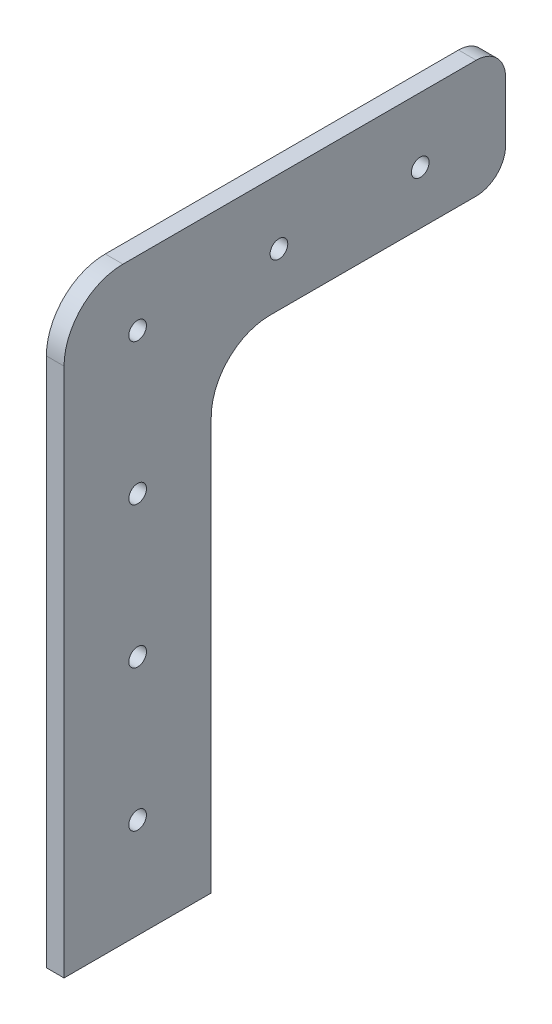
ISO-10303-21;
HEADER;
FILE_DESCRIPTION(('STEP AP214'),'2;1');
FILE_NAME('part.step','',(''),(''),'','','');
FILE_SCHEMA(('AUTOMOTIVE_DESIGN { 1 0 10303 214 1 1 1 1 }'));
ENDSEC;
DATA;
#1=APPLICATION_CONTEXT('core data for automotive mechanical design processes');
#2=APPLICATION_PROTOCOL_DEFINITION('international standard','automotive_design',2000,#1);
#3=PRODUCT_CONTEXT('',#1,'mechanical');
#4=PRODUCT('Part','Part','',(#3));
#5=PRODUCT_RELATED_PRODUCT_CATEGORY('part','',(#4));
#6=PRODUCT_DEFINITION_FORMATION('','',#4);
#7=PRODUCT_DEFINITION_CONTEXT('part definition',#1,'design');
#8=PRODUCT_DEFINITION('design','',#6,#7);
#9=PRODUCT_DEFINITION_SHAPE('','',#8);
#10=(LENGTH_UNIT() NAMED_UNIT(*) SI_UNIT(.MILLI.,.METRE.));
#11=(NAMED_UNIT(*) PLANE_ANGLE_UNIT() SI_UNIT($,.RADIAN.));
#12=(NAMED_UNIT(*) SI_UNIT($,.STERADIAN.) SOLID_ANGLE_UNIT());
#13=UNCERTAINTY_MEASURE_WITH_UNIT(LENGTH_MEASURE(1.E-05),#10,'distance_accuracy_value','');
#14=(GEOMETRIC_REPRESENTATION_CONTEXT(3) GLOBAL_UNCERTAINTY_ASSIGNED_CONTEXT((#13)) GLOBAL_UNIT_ASSIGNED_CONTEXT((#10,
#11,#12)) REPRESENTATION_CONTEXT('',''));
#15=CARTESIAN_POINT('',(0.,0.,0.));
#16=DIRECTION('',(0.,0.,1.));
#17=DIRECTION('',(1.,0.,0.));
#18=AXIS2_PLACEMENT_3D('',#15,#16,#17);
#19=CARTESIAN_POINT('',(3.,0.,0.));
#20=DIRECTION('',(0.,0.,-1.));
#21=DIRECTION('',(-1.,0.,0.));
#22=AXIS2_PLACEMENT_3D('',#19,#20,#21);
#23=PLANE('',#22);
#24=DIRECTION('',(0.,-1.,0.));
#25=VECTOR('',#24,1.);
#26=CARTESIAN_POINT('',(3.,0.,0.));
#27=LINE('',#26,#25);
#28=CARTESIAN_POINT('',(3.,-10.,0.));
#29=VERTEX_POINT('',#28);
#30=CARTESIAN_POINT('',(3.,-100.,0.));
#31=VERTEX_POINT('',#30);
#32=EDGE_CURVE('E148',#29,#31,#27,.T.);
#33=ORIENTED_EDGE('',*,*,#32,.F.);
#34=DIRECTION('',(-1.,0.,0.));
#35=VECTOR('',#34,1.);
#36=CARTESIAN_POINT('',(3.,-10.,0.));
#37=LINE('',#36,#35);
#38=CARTESIAN_POINT('',(0.,-10.,0.));
#39=VERTEX_POINT('',#38);
#40=EDGE_CURVE('E156',#29,#39,#37,.T.);
#41=ORIENTED_EDGE('',*,*,#40,.T.);
#42=DIRECTION('',(0.,-1.,0.));
#43=VECTOR('',#42,1.);
#44=CARTESIAN_POINT('',(0.,0.,0.));
#45=LINE('',#44,#43);
#46=CARTESIAN_POINT('',(0.,-100.,0.));
#47=VERTEX_POINT('',#46);
#48=EDGE_CURVE('E135',#39,#47,#45,.T.);
#49=ORIENTED_EDGE('',*,*,#48,.T.);
#50=DIRECTION('',(-1.,0.,0.));
#51=VECTOR('',#50,1.);
#52=CARTESIAN_POINT('',(3.,-100.,0.));
#53=LINE('',#52,#51);
#54=EDGE_CURVE('E139',#31,#47,#53,.T.);
#55=ORIENTED_EDGE('',*,*,#54,.F.);
#56=EDGE_LOOP('',(#33,#41,#49,#55));
#57=FACE_BOUND('',#56,.T.);
#58=ADVANCED_FACE('F32',(#57),#23,.F.);
#59=CARTESIAN_POINT('',(3.,-100.,0.));
#60=DIRECTION('',(0.,1.,0.));
#61=DIRECTION('',(0.,0.,1.));
#62=AXIS2_PLACEMENT_3D('',#59,#60,#61);
#63=PLANE('',#62);
#64=DIRECTION('',(0.,0.,-1.));
#65=VECTOR('',#64,1.);
#66=CARTESIAN_POINT('',(0.,-100.,0.));
#67=LINE('',#66,#65);
#68=CARTESIAN_POINT('',(0.,-100.,-25.));
#69=VERTEX_POINT('',#68);
#70=EDGE_CURVE('E117',#47,#69,#67,.T.);
#71=ORIENTED_EDGE('',*,*,#70,.T.);
#72=DIRECTION('',(1.,0.,0.));
#73=VECTOR('',#72,1.);
#74=CARTESIAN_POINT('',(0.,-100.,-25.));
#75=LINE('',#74,#73);
#76=CARTESIAN_POINT('',(3.,-100.,-25.));
#77=VERTEX_POINT('',#76);
#78=EDGE_CURVE('E128',#69,#77,#75,.T.);
#79=ORIENTED_EDGE('',*,*,#78,.T.);
#80=DIRECTION('',(0.,0.,-1.));
#81=VECTOR('',#80,1.);
#82=CARTESIAN_POINT('',(3.,-100.,0.));
#83=LINE('',#82,#81);
#84=EDGE_CURVE('E208',#31,#77,#83,.T.);
#85=ORIENTED_EDGE('',*,*,#84,.F.);
#86=ORIENTED_EDGE('',*,*,#54,.T.);
#87=EDGE_LOOP('',(#71,#79,#85,#86));
#88=FACE_BOUND('',#87,.T.);
#89=ADVANCED_FACE('F137',(#88),#63,.F.);
#90=CARTESIAN_POINT('',(3.,0.,-75.));
#91=DIRECTION('',(0.,0.,1.));
#92=DIRECTION('',(0.,-1.,0.));
#93=AXIS2_PLACEMENT_3D('',#90,#91,#92);
#94=PLANE('',#93);
#95=DIRECTION('',(0.,1.,0.));
#96=VECTOR('',#95,1.);
#97=CARTESIAN_POINT('',(0.,0.,-75.));
#98=LINE('',#97,#96);
#99=CARTESIAN_POINT('',(0.,-15.,-75.));
#100=VERTEX_POINT('',#99);
#101=CARTESIAN_POINT('',(0.,-5.,-75.));
#102=VERTEX_POINT('',#101);
#103=EDGE_CURVE('E140',#100,#102,#98,.T.);
#104=ORIENTED_EDGE('',*,*,#103,.T.);
#105=DIRECTION('',(-1.,0.,0.));
#106=VECTOR('',#105,1.);
#107=CARTESIAN_POINT('',(3.,-5.,-75.));
#108=LINE('',#107,#106);
#109=CARTESIAN_POINT('',(3.,-5.,-75.));
#110=VERTEX_POINT('',#109);
#111=EDGE_CURVE('E54',#102,#110,#108,.F.);
#112=ORIENTED_EDGE('',*,*,#111,.T.);
#113=DIRECTION('',(0.,1.,0.));
#114=VECTOR('',#113,1.);
#115=CARTESIAN_POINT('',(3.,0.,-75.));
#116=LINE('',#115,#114);
#117=CARTESIAN_POINT('',(3.,-15.,-75.));
#118=VERTEX_POINT('',#117);
#119=EDGE_CURVE('E185',#118,#110,#116,.T.);
#120=ORIENTED_EDGE('',*,*,#119,.F.);
#121=DIRECTION('',(1.,0.,0.));
#122=VECTOR('',#121,1.);
#123=CARTESIAN_POINT('',(3.,-15.,-75.));
#124=LINE('',#123,#122);
#125=EDGE_CURVE('E178',#118,#100,#124,.F.);
#126=ORIENTED_EDGE('',*,*,#125,.T.);
#127=EDGE_LOOP('',(#104,#112,#120,#126));
#128=FACE_BOUND('',#127,.T.);
#129=ADVANCED_FACE('F195',(#128),#94,.F.);
#130=CARTESIAN_POINT('',(3.,0.,0.));
#131=DIRECTION('',(0.,-1.,0.));
#132=DIRECTION('',(0.,0.,-1.));
#133=AXIS2_PLACEMENT_3D('',#130,#131,#132);
#134=PLANE('',#133);
#135=DIRECTION('',(0.,0.,1.));
#136=VECTOR('',#135,1.);
#137=CARTESIAN_POINT('',(3.,0.,0.));
#138=LINE('',#137,#136);
#139=CARTESIAN_POINT('',(3.,0.,-70.));
#140=VERTEX_POINT('',#139);
#141=CARTESIAN_POINT('',(3.,0.,-10.));
#142=VERTEX_POINT('',#141);
#143=EDGE_CURVE('E151',#140,#142,#138,.T.);
#144=ORIENTED_EDGE('',*,*,#143,.F.);
#145=DIRECTION('',(-1.,0.,0.));
#146=VECTOR('',#145,1.);
#147=CARTESIAN_POINT('',(3.,0.,-70.));
#148=LINE('',#147,#146);
#149=CARTESIAN_POINT('',(0.,0.,-70.));
#150=VERTEX_POINT('',#149);
#151=EDGE_CURVE('E171',#140,#150,#148,.T.);
#152=ORIENTED_EDGE('',*,*,#151,.T.);
#153=DIRECTION('',(0.,0.,1.));
#154=VECTOR('',#153,1.);
#155=CARTESIAN_POINT('',(0.,0.,0.));
#156=LINE('',#155,#154);
#157=CARTESIAN_POINT('',(0.,0.,-10.));
#158=VERTEX_POINT('',#157);
#159=EDGE_CURVE('E142',#150,#158,#156,.T.);
#160=ORIENTED_EDGE('',*,*,#159,.T.);
#161=DIRECTION('',(-1.,0.,0.));
#162=VECTOR('',#161,1.);
#163=CARTESIAN_POINT('',(3.,0.,-10.));
#164=LINE('',#163,#162);
#165=EDGE_CURVE('E162',#158,#142,#164,.F.);
#166=ORIENTED_EDGE('',*,*,#165,.T.);
#167=EDGE_LOOP('',(#144,#152,#160,#166));
#168=FACE_BOUND('',#167,.T.);
#169=ADVANCED_FACE('F189',(#168),#134,.F.);
#170=CARTESIAN_POINT('',(3.,0.,0.));
#171=DIRECTION('',(1.,0.,0.));
#172=DIRECTION('',(0.,0.,-1.));
#173=AXIS2_PLACEMENT_3D('',#170,#171,#172);
#174=PLANE('',#173);
#175=CARTESIAN_POINT('',(3.,-59.,-12.5));
#176=DIRECTION('',(1.,0.,0.));
#177=DIRECTION('',(0.,0.,-1.));
#178=AXIS2_PLACEMENT_3D('',#175,#176,#177);
#179=CIRCLE('',#178,1.5);
#180=CARTESIAN_POINT('',(3.,-59.,-14.));
#181=VERTEX_POINT('',#180);
#182=EDGE_CURVE('E286',#181,#181,#179,.T.);
#183=ORIENTED_EDGE('',*,*,#182,.F.);
#184=EDGE_LOOP('',(#183));
#185=FACE_BOUND('',#184,.T.);
#186=CARTESIAN_POINT('',(3.,-83.,-12.5));
#187=DIRECTION('',(1.,0.,0.));
#188=DIRECTION('',(0.,0.,-1.));
#189=AXIS2_PLACEMENT_3D('',#186,#187,#188);
#190=CIRCLE('',#189,1.5);
#191=CARTESIAN_POINT('',(3.,-83.,-14.));
#192=VERTEX_POINT('',#191);
#193=EDGE_CURVE('E292',#192,#192,#190,.T.);
#194=ORIENTED_EDGE('',*,*,#193,.F.);
#195=EDGE_LOOP('',(#194));
#196=FACE_BOUND('',#195,.T.);
#197=CARTESIAN_POINT('',(3.,-11.,-60.5));
#198=DIRECTION('',(1.,0.,0.));
#199=DIRECTION('',(0.,0.,-1.));
#200=AXIS2_PLACEMENT_3D('',#197,#198,#199);
#201=CIRCLE('',#200,1.5);
#202=CARTESIAN_POINT('',(3.,-11.,-62.));
#203=VERTEX_POINT('',#202);
#204=EDGE_CURVE('E298',#203,#203,#201,.T.);
#205=ORIENTED_EDGE('',*,*,#204,.F.);
#206=EDGE_LOOP('',(#205));
#207=FACE_BOUND('',#206,.T.);
#208=CARTESIAN_POINT('',(3.,-35.,-12.5));
#209=DIRECTION('',(1.,0.,0.));
#210=DIRECTION('',(0.,0.,-1.));
#211=AXIS2_PLACEMENT_3D('',#208,#209,#210);
#212=CIRCLE('',#211,1.5);
#213=CARTESIAN_POINT('',(3.,-35.,-14.));
#214=VERTEX_POINT('',#213);
#215=EDGE_CURVE('E279',#214,#214,#212,.T.);
#216=ORIENTED_EDGE('',*,*,#215,.F.);
#217=EDGE_LOOP('',(#216));
#218=FACE_BOUND('',#217,.T.);
#219=CARTESIAN_POINT('',(3.,-11.,-36.5));
#220=DIRECTION('',(1.,0.,0.));
#221=DIRECTION('',(0.,0.,-1.));
#222=AXIS2_PLACEMENT_3D('',#219,#220,#221);
#223=CIRCLE('',#222,1.5);
#224=CARTESIAN_POINT('',(3.,-11.,-38.));
#225=VERTEX_POINT('',#224);
#226=EDGE_CURVE('E276',#225,#225,#223,.T.);
#227=ORIENTED_EDGE('',*,*,#226,.F.);
#228=EDGE_LOOP('',(#227));
#229=FACE_BOUND('',#228,.T.);
#230=CARTESIAN_POINT('',(3.,-11.,-12.5));
#231=DIRECTION('',(1.,0.,0.));
#232=DIRECTION('',(0.,0.,-1.));
#233=AXIS2_PLACEMENT_3D('',#230,#231,#232);
#234=CIRCLE('',#233,1.5);
#235=CARTESIAN_POINT('',(3.,-11.,-14.));
#236=VERTEX_POINT('',#235);
#237=EDGE_CURVE('E285',#236,#236,#234,.T.);
#238=ORIENTED_EDGE('',*,*,#237,.F.);
#239=EDGE_LOOP('',(#238));
#240=FACE_BOUND('',#239,.T.);
#241=ORIENTED_EDGE('',*,*,#119,.T.);
#242=CARTESIAN_POINT('',(3.,-5.,-70.));
#243=DIRECTION('',(1.,0.,0.));
#244=DIRECTION('',(0.,0.,-1.));
#245=AXIS2_PLACEMENT_3D('',#242,#243,#244);
#246=CIRCLE('',#245,5.);
#247=EDGE_CURVE('E40',#110,#140,#246,.T.);
#248=ORIENTED_EDGE('',*,*,#247,.T.);
#249=ORIENTED_EDGE('',*,*,#143,.T.);
#250=CARTESIAN_POINT('',(3.,-10.,-10.));
#251=DIRECTION('',(1.,0.,0.));
#252=DIRECTION('',(0.,0.,-1.));
#253=AXIS2_PLACEMENT_3D('',#250,#251,#252);
#254=CIRCLE('',#253,10.);
#255=EDGE_CURVE('E165',#142,#29,#254,.T.);
#256=ORIENTED_EDGE('',*,*,#255,.T.);
#257=ORIENTED_EDGE('',*,*,#32,.T.);
#258=ORIENTED_EDGE('',*,*,#84,.T.);
#259=DIRECTION('',(0.,-1.,0.));
#260=VECTOR('',#259,1.);
#261=CARTESIAN_POINT('',(3.,-20.,-25.));
#262=LINE('',#261,#260);
#263=CARTESIAN_POINT('',(3.,-30.,-25.));
#264=VERTEX_POINT('',#263);
#265=EDGE_CURVE('E131',#264,#77,#262,.T.);
#266=ORIENTED_EDGE('',*,*,#265,.F.);
#267=CARTESIAN_POINT('',(3.,-30.,-35.));
#268=DIRECTION('',(1.,0.,0.));
#269=DIRECTION('',(0.,0.,-1.));
#270=AXIS2_PLACEMENT_3D('',#267,#268,#269);
#271=CIRCLE('',#270,10.);
#272=CARTESIAN_POINT('',(3.,-20.,-35.));
#273=VERTEX_POINT('',#272);
#274=EDGE_CURVE('E167',#264,#273,#271,.F.);
#275=ORIENTED_EDGE('',*,*,#274,.T.);
#276=DIRECTION('',(0.,0.,1.));
#277=VECTOR('',#276,1.);
#278=CARTESIAN_POINT('',(3.,-20.,-25.));
#279=LINE('',#278,#277);
#280=CARTESIAN_POINT('',(3.,-20.,-70.));
#281=VERTEX_POINT('',#280);
#282=EDGE_CURVE('E125',#281,#273,#279,.T.);
#283=ORIENTED_EDGE('',*,*,#282,.F.);
#284=CARTESIAN_POINT('',(3.,-15.,-70.));
#285=DIRECTION('',(1.,0.,0.));
#286=DIRECTION('',(0.,0.,-1.));
#287=AXIS2_PLACEMENT_3D('',#284,#285,#286);
#288=CIRCLE('',#287,5.);
#289=EDGE_CURVE('E47',#281,#118,#288,.T.);
#290=ORIENTED_EDGE('',*,*,#289,.T.);
#291=EDGE_LOOP('',(#241,#248,#249,#256,#257,#258,#266,#275,#283,#290));
#292=FACE_BOUND('',#291,.T.);
#293=ADVANCED_FACE('F184',(#185,#196,#207,#218,#229,#240,#292),#174,.T.);
#294=CARTESIAN_POINT('',(0.,0.,0.));
#295=DIRECTION('',(1.,0.,0.));
#296=DIRECTION('',(0.,0.,-1.));
#297=AXIS2_PLACEMENT_3D('',#294,#295,#296);
#298=PLANE('',#297);
#299=CARTESIAN_POINT('',(0.,-59.,-12.5));
#300=DIRECTION('',(1.,0.,0.));
#301=DIRECTION('',(0.,0.,-1.));
#302=AXIS2_PLACEMENT_3D('',#299,#300,#301);
#303=CIRCLE('',#302,1.5);
#304=CARTESIAN_POINT('',(0.,-59.,-14.));
#305=VERTEX_POINT('',#304);
#306=EDGE_CURVE('E282',#305,#305,#303,.T.);
#307=ORIENTED_EDGE('',*,*,#306,.T.);
#308=EDGE_LOOP('',(#307));
#309=FACE_BOUND('',#308,.T.);
#310=CARTESIAN_POINT('',(0.,-83.,-12.5));
#311=DIRECTION('',(1.,0.,0.));
#312=DIRECTION('',(0.,0.,-1.));
#313=AXIS2_PLACEMENT_3D('',#310,#311,#312);
#314=CIRCLE('',#313,1.5);
#315=CARTESIAN_POINT('',(0.,-83.,-14.));
#316=VERTEX_POINT('',#315);
#317=EDGE_CURVE('E289',#316,#316,#314,.T.);
#318=ORIENTED_EDGE('',*,*,#317,.T.);
#319=EDGE_LOOP('',(#318));
#320=FACE_BOUND('',#319,.T.);
#321=CARTESIAN_POINT('',(0.,-11.,-60.5));
#322=DIRECTION('',(1.,0.,0.));
#323=DIRECTION('',(0.,0.,-1.));
#324=AXIS2_PLACEMENT_3D('',#321,#322,#323);
#325=CIRCLE('',#324,1.5);
#326=CARTESIAN_POINT('',(0.,-11.,-62.));
#327=VERTEX_POINT('',#326);
#328=EDGE_CURVE('E295',#327,#327,#325,.T.);
#329=ORIENTED_EDGE('',*,*,#328,.T.);
#330=EDGE_LOOP('',(#329));
#331=FACE_BOUND('',#330,.T.);
#332=CARTESIAN_POINT('',(0.,-35.,-12.5));
#333=DIRECTION('',(1.,0.,0.));
#334=DIRECTION('',(0.,0.,-1.));
#335=AXIS2_PLACEMENT_3D('',#332,#333,#334);
#336=CIRCLE('',#335,1.5);
#337=CARTESIAN_POINT('',(0.,-35.,-14.));
#338=VERTEX_POINT('',#337);
#339=EDGE_CURVE('E301',#338,#338,#336,.T.);
#340=ORIENTED_EDGE('',*,*,#339,.T.);
#341=EDGE_LOOP('',(#340));
#342=FACE_BOUND('',#341,.T.);
#343=CARTESIAN_POINT('',(0.,-11.,-36.5));
#344=DIRECTION('',(1.,0.,0.));
#345=DIRECTION('',(0.,0.,-1.));
#346=AXIS2_PLACEMENT_3D('',#343,#344,#345);
#347=CIRCLE('',#346,1.5);
#348=CARTESIAN_POINT('',(0.,-11.,-38.));
#349=VERTEX_POINT('',#348);
#350=EDGE_CURVE('E273',#349,#349,#347,.T.);
#351=ORIENTED_EDGE('',*,*,#350,.T.);
#352=EDGE_LOOP('',(#351));
#353=FACE_BOUND('',#352,.T.);
#354=CARTESIAN_POINT('',(0.,-11.,-12.5));
#355=DIRECTION('',(1.,0.,0.));
#356=DIRECTION('',(0.,0.,-1.));
#357=AXIS2_PLACEMENT_3D('',#354,#355,#356);
#358=CIRCLE('',#357,1.5);
#359=CARTESIAN_POINT('',(0.,-11.,-14.));
#360=VERTEX_POINT('',#359);
#361=EDGE_CURVE('E205',#360,#360,#358,.T.);
#362=ORIENTED_EDGE('',*,*,#361,.T.);
#363=EDGE_LOOP('',(#362));
#364=FACE_BOUND('',#363,.T.);
#365=ORIENTED_EDGE('',*,*,#159,.F.);
#366=CARTESIAN_POINT('',(0.,-5.,-70.));
#367=DIRECTION('',(1.,0.,0.));
#368=DIRECTION('',(0.,0.,-1.));
#369=AXIS2_PLACEMENT_3D('',#366,#367,#368);
#370=CIRCLE('',#369,5.);
#371=EDGE_CURVE('E176',#150,#102,#370,.F.);
#372=ORIENTED_EDGE('',*,*,#371,.T.);
#373=ORIENTED_EDGE('',*,*,#103,.F.);
#374=CARTESIAN_POINT('',(0.,-15.,-70.));
#375=DIRECTION('',(1.,0.,0.));
#376=DIRECTION('',(0.,0.,-1.));
#377=AXIS2_PLACEMENT_3D('',#374,#375,#376);
#378=CIRCLE('',#377,5.);
#379=CARTESIAN_POINT('',(0.,-20.,-70.));
#380=VERTEX_POINT('',#379);
#381=EDGE_CURVE('E174',#100,#380,#378,.F.);
#382=ORIENTED_EDGE('',*,*,#381,.T.);
#383=DIRECTION('',(0.,0.,1.));
#384=VECTOR('',#383,1.);
#385=CARTESIAN_POINT('',(0.,-20.,-25.));
#386=LINE('',#385,#384);
#387=CARTESIAN_POINT('',(0.,-20.,-35.));
#388=VERTEX_POINT('',#387);
#389=EDGE_CURVE('E124',#380,#388,#386,.T.);
#390=ORIENTED_EDGE('',*,*,#389,.T.);
#391=CARTESIAN_POINT('',(0.,-30.,-35.));
#392=DIRECTION('',(1.,0.,0.));
#393=DIRECTION('',(0.,0.,-1.));
#394=AXIS2_PLACEMENT_3D('',#391,#392,#393);
#395=CIRCLE('',#394,10.);
#396=CARTESIAN_POINT('',(0.,-30.,-25.));
#397=VERTEX_POINT('',#396);
#398=EDGE_CURVE('E120',#388,#397,#395,.T.);
#399=ORIENTED_EDGE('',*,*,#398,.T.);
#400=DIRECTION('',(0.,-1.,0.));
#401=VECTOR('',#400,1.);
#402=CARTESIAN_POINT('',(0.,-20.,-25.));
#403=LINE('',#402,#401);
#404=EDGE_CURVE('E111',#397,#69,#403,.T.);
#405=ORIENTED_EDGE('',*,*,#404,.T.);
#406=ORIENTED_EDGE('',*,*,#70,.F.);
#407=ORIENTED_EDGE('',*,*,#48,.F.);
#408=CARTESIAN_POINT('',(0.,-10.,-10.));
#409=DIRECTION('',(1.,0.,0.));
#410=DIRECTION('',(0.,0.,-1.));
#411=AXIS2_PLACEMENT_3D('',#408,#409,#410);
#412=CIRCLE('',#411,10.);
#413=EDGE_CURVE('E159',#39,#158,#412,.F.);
#414=ORIENTED_EDGE('',*,*,#413,.T.);
#415=EDGE_LOOP('',(#365,#372,#373,#382,#390,#399,#405,#406,#407,#414));
#416=FACE_BOUND('',#415,.T.);
#417=ADVANCED_FACE('F114',(#309,#320,#331,#342,#353,#364,#416),#298,.F.);
#418=CARTESIAN_POINT('',(0.,-20.,-25.));
#419=DIRECTION('',(0.,0.,1.));
#420=DIRECTION('',(0.,-1.,0.));
#421=AXIS2_PLACEMENT_3D('',#418,#419,#420);
#422=PLANE('',#421);
#423=ORIENTED_EDGE('',*,*,#404,.F.);
#424=DIRECTION('',(1.,0.,0.));
#425=VECTOR('',#424,1.);
#426=CARTESIAN_POINT('',(3.,-30.,-25.));
#427=LINE('',#426,#425);
#428=EDGE_CURVE('E150',#397,#264,#427,.T.);
#429=ORIENTED_EDGE('',*,*,#428,.T.);
#430=ORIENTED_EDGE('',*,*,#265,.T.);
#431=ORIENTED_EDGE('',*,*,#78,.F.);
#432=EDGE_LOOP('',(#423,#429,#430,#431));
#433=FACE_BOUND('',#432,.T.);
#434=ADVANCED_FACE('F129',(#433),#422,.F.);
#435=CARTESIAN_POINT('',(0.,-20.,-25.));
#436=DIRECTION('',(0.,1.,0.));
#437=DIRECTION('',(0.,0.,1.));
#438=AXIS2_PLACEMENT_3D('',#435,#436,#437);
#439=PLANE('',#438);
#440=ORIENTED_EDGE('',*,*,#389,.F.);
#441=DIRECTION('',(1.,0.,0.));
#442=VECTOR('',#441,1.);
#443=CARTESIAN_POINT('',(0.,-20.,-70.));
#444=LINE('',#443,#442);
#445=EDGE_CURVE('E11',#380,#281,#444,.T.);
#446=ORIENTED_EDGE('',*,*,#445,.T.);
#447=ORIENTED_EDGE('',*,*,#282,.T.);
#448=DIRECTION('',(1.,0.,0.));
#449=VECTOR('',#448,1.);
#450=CARTESIAN_POINT('',(0.,-20.,-35.));
#451=LINE('',#450,#449);
#452=EDGE_CURVE('E153',#273,#388,#451,.F.);
#453=ORIENTED_EDGE('',*,*,#452,.T.);
#454=EDGE_LOOP('',(#440,#446,#447,#453));
#455=FACE_BOUND('',#454,.T.);
#456=ADVANCED_FACE('F198',(#455),#439,.F.);
#457=CARTESIAN_POINT('',(0.,-30.,-35.));
#458=DIRECTION('',(-1.,0.,0.));
#459=DIRECTION('',(0.,0.,1.));
#460=AXIS2_PLACEMENT_3D('',#457,#458,#459);
#461=CYLINDRICAL_SURFACE('',#460,10.);
#462=ORIENTED_EDGE('',*,*,#398,.F.);
#463=ORIENTED_EDGE('',*,*,#452,.F.);
#464=ORIENTED_EDGE('',*,*,#274,.F.);
#465=ORIENTED_EDGE('',*,*,#428,.F.);
#466=EDGE_LOOP('',(#462,#463,#464,#465));
#467=FACE_BOUND('',#466,.T.);
#468=ADVANCED_FACE('F216',(#467),#461,.F.);
#469=CARTESIAN_POINT('',(3.,-10.,-10.));
#470=DIRECTION('',(-1.,0.,0.));
#471=DIRECTION('',(0.,0.,1.));
#472=AXIS2_PLACEMENT_3D('',#469,#470,#471);
#473=CYLINDRICAL_SURFACE('',#472,10.);
#474=ORIENTED_EDGE('',*,*,#255,.F.);
#475=ORIENTED_EDGE('',*,*,#165,.F.);
#476=ORIENTED_EDGE('',*,*,#413,.F.);
#477=ORIENTED_EDGE('',*,*,#40,.F.);
#478=EDGE_LOOP('',(#474,#475,#476,#477));
#479=FACE_BOUND('',#478,.T.);
#480=ADVANCED_FACE('F214',(#479),#473,.T.);
#481=CARTESIAN_POINT('',(3.,-5.,-70.));
#482=DIRECTION('',(-1.,0.,0.));
#483=DIRECTION('',(0.,0.,1.));
#484=AXIS2_PLACEMENT_3D('',#481,#482,#483);
#485=CYLINDRICAL_SURFACE('',#484,5.);
#486=ORIENTED_EDGE('',*,*,#247,.F.);
#487=ORIENTED_EDGE('',*,*,#111,.F.);
#488=ORIENTED_EDGE('',*,*,#371,.F.);
#489=ORIENTED_EDGE('',*,*,#151,.F.);
#490=EDGE_LOOP('',(#486,#487,#488,#489));
#491=FACE_BOUND('',#490,.T.);
#492=ADVANCED_FACE('F192',(#491),#485,.T.);
#493=CARTESIAN_POINT('',(0.,-15.,-70.));
#494=DIRECTION('',(1.,0.,0.));
#495=DIRECTION('',(0.,0.,-1.));
#496=AXIS2_PLACEMENT_3D('',#493,#494,#495);
#497=CYLINDRICAL_SURFACE('',#496,5.);
#498=ORIENTED_EDGE('',*,*,#381,.F.);
#499=ORIENTED_EDGE('',*,*,#125,.F.);
#500=ORIENTED_EDGE('',*,*,#289,.F.);
#501=ORIENTED_EDGE('',*,*,#445,.F.);
#502=EDGE_LOOP('',(#498,#499,#500,#501));
#503=FACE_BOUND('',#502,.T.);
#504=ADVANCED_FACE('F34',(#503),#497,.T.);
#505=CARTESIAN_POINT('',(0.,-11.,-12.5));
#506=DIRECTION('',(1.,0.,0.));
#507=DIRECTION('',(0.,0.,-1.));
#508=AXIS2_PLACEMENT_3D('',#505,#506,#507);
#509=CYLINDRICAL_SURFACE('',#508,1.5);
#510=ORIENTED_EDGE('',*,*,#361,.F.);
#511=EDGE_LOOP('',(#510));
#512=FACE_BOUND('',#511,.T.);
#513=ORIENTED_EDGE('',*,*,#237,.T.);
#514=EDGE_LOOP('',(#513));
#515=FACE_BOUND('',#514,.T.);
#516=ADVANCED_FACE('F245',(#512,#515),#509,.F.);
#517=CARTESIAN_POINT('',(0.,-11.,-36.5));
#518=DIRECTION('',(1.,0.,0.));
#519=DIRECTION('',(0.,0.,-1.));
#520=AXIS2_PLACEMENT_3D('',#517,#518,#519);
#521=CYLINDRICAL_SURFACE('',#520,1.5);
#522=ORIENTED_EDGE('',*,*,#350,.F.);
#523=EDGE_LOOP('',(#522));
#524=FACE_BOUND('',#523,.T.);
#525=ORIENTED_EDGE('',*,*,#226,.T.);
#526=EDGE_LOOP('',(#525));
#527=FACE_BOUND('',#526,.T.);
#528=ADVANCED_FACE('F248',(#524,#527),#521,.F.);
#529=CARTESIAN_POINT('',(0.,-35.,-12.5));
#530=DIRECTION('',(1.,0.,0.));
#531=DIRECTION('',(0.,0.,-1.));
#532=AXIS2_PLACEMENT_3D('',#529,#530,#531);
#533=CYLINDRICAL_SURFACE('',#532,1.5);
#534=ORIENTED_EDGE('',*,*,#339,.F.);
#535=EDGE_LOOP('',(#534));
#536=FACE_BOUND('',#535,.T.);
#537=ORIENTED_EDGE('',*,*,#215,.T.);
#538=EDGE_LOOP('',(#537));
#539=FACE_BOUND('',#538,.T.);
#540=ADVANCED_FACE('F250',(#536,#539),#533,.F.);
#541=CARTESIAN_POINT('',(0.,-11.,-60.5));
#542=DIRECTION('',(1.,0.,0.));
#543=DIRECTION('',(0.,0.,-1.));
#544=AXIS2_PLACEMENT_3D('',#541,#542,#543);
#545=CYLINDRICAL_SURFACE('',#544,1.5);
#546=ORIENTED_EDGE('',*,*,#328,.F.);
#547=EDGE_LOOP('',(#546));
#548=FACE_BOUND('',#547,.T.);
#549=ORIENTED_EDGE('',*,*,#204,.T.);
#550=EDGE_LOOP('',(#549));
#551=FACE_BOUND('',#550,.T.);
#552=ADVANCED_FACE('F253',(#548,#551),#545,.F.);
#553=CARTESIAN_POINT('',(0.,-83.,-12.5));
#554=DIRECTION('',(1.,0.,0.));
#555=DIRECTION('',(0.,0.,-1.));
#556=AXIS2_PLACEMENT_3D('',#553,#554,#555);
#557=CYLINDRICAL_SURFACE('',#556,1.5);
#558=ORIENTED_EDGE('',*,*,#317,.F.);
#559=EDGE_LOOP('',(#558));
#560=FACE_BOUND('',#559,.T.);
#561=ORIENTED_EDGE('',*,*,#193,.T.);
#562=EDGE_LOOP('',(#561));
#563=FACE_BOUND('',#562,.T.);
#564=ADVANCED_FACE('F257',(#560,#563),#557,.F.);
#565=CARTESIAN_POINT('',(0.,-59.,-12.5));
#566=DIRECTION('',(1.,0.,0.));
#567=DIRECTION('',(0.,0.,-1.));
#568=AXIS2_PLACEMENT_3D('',#565,#566,#567);
#569=CYLINDRICAL_SURFACE('',#568,1.5);
#570=ORIENTED_EDGE('',*,*,#306,.F.);
#571=EDGE_LOOP('',(#570));
#572=FACE_BOUND('',#571,.T.);
#573=ORIENTED_EDGE('',*,*,#182,.T.);
#574=EDGE_LOOP('',(#573));
#575=FACE_BOUND('',#574,.T.);
#576=ADVANCED_FACE('F261',(#572,#575),#569,.F.);
#577=CLOSED_SHELL('',(#58,#89,#129,#169,#293,#417,#434,#456,#468,#480,#492,#504,#516,#528,#540,
#552,#564,#576));
#578=MANIFOLD_SOLID_BREP('B2',#577);
#579=ADVANCED_BREP_SHAPE_REPRESENTATION('',(#18,#578),#14);
#580=SHAPE_DEFINITION_REPRESENTATION(#9,#579);
ENDSEC;
END-ISO-10303-21;
